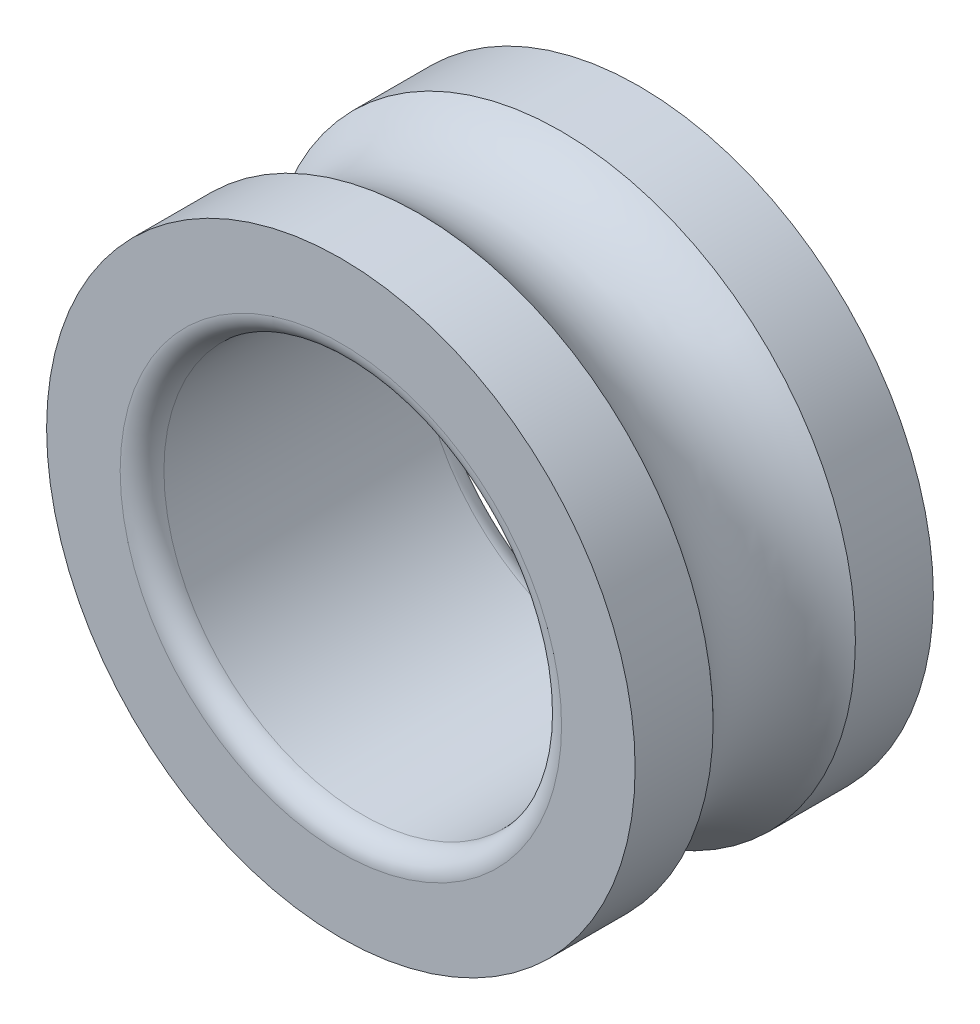
ISO-10303-21;
HEADER;
FILE_DESCRIPTION(('STEP AP214'),'2;1');
FILE_NAME('part.step','',(''),(''),'','','');
FILE_SCHEMA(('AUTOMOTIVE_DESIGN { 1 0 10303 214 1 1 1 1 }'));
ENDSEC;
DATA;
#1=APPLICATION_CONTEXT('core data for automotive mechanical design processes');
#2=APPLICATION_PROTOCOL_DEFINITION('international standard','automotive_design',2000,#1);
#3=PRODUCT_CONTEXT('',#1,'mechanical');
#4=PRODUCT('Part','Part','',(#3));
#5=PRODUCT_RELATED_PRODUCT_CATEGORY('part','',(#4));
#6=PRODUCT_DEFINITION_FORMATION('','',#4);
#7=PRODUCT_DEFINITION_CONTEXT('part definition',#1,'design');
#8=PRODUCT_DEFINITION('design','',#6,#7);
#9=PRODUCT_DEFINITION_SHAPE('','',#8);
#10=(LENGTH_UNIT() NAMED_UNIT(*) SI_UNIT(.MILLI.,.METRE.));
#11=(NAMED_UNIT(*) PLANE_ANGLE_UNIT() SI_UNIT($,.RADIAN.));
#12=(NAMED_UNIT(*) SI_UNIT($,.STERADIAN.) SOLID_ANGLE_UNIT());
#13=UNCERTAINTY_MEASURE_WITH_UNIT(LENGTH_MEASURE(1.E-05),#10,'distance_accuracy_value','');
#14=(GEOMETRIC_REPRESENTATION_CONTEXT(3) GLOBAL_UNCERTAINTY_ASSIGNED_CONTEXT((#13)) GLOBAL_UNIT_ASSIGNED_CONTEXT((#10,
#11,#12)) REPRESENTATION_CONTEXT('',''));
#15=CARTESIAN_POINT('',(0.,0.,0.));
#16=DIRECTION('',(0.,0.,1.));
#17=DIRECTION('',(1.,0.,0.));
#18=AXIS2_PLACEMENT_3D('',#15,#16,#17);
#19=CARTESIAN_POINT('',(0.,0.,0.));
#20=DIRECTION('',(0.,0.,-1.));
#21=DIRECTION('',(-1.,0.,0.));
#22=AXIS2_PLACEMENT_3D('',#19,#20,#21);
#23=TOROIDAL_SURFACE('',#22,12.42,3.312);
#24=CARTESIAN_POINT('',(0.,0.,-2.46861904715977));
#25=DIRECTION('',(0.,0.,-1.));
#26=DIRECTION('',(-1.,0.,0.));
#27=AXIS2_PLACEMENT_3D('',#24,#25,#26);
#28=CIRCLE('',#27,10.212);
#29=CARTESIAN_POINT('',(-10.212,0.,-2.46861904715977));
#30=VERTEX_POINT('',#29);
#31=EDGE_CURVE('E69',#30,#30,#28,.T.);
#32=ORIENTED_EDGE('',*,*,#31,.F.);
#33=EDGE_LOOP('',(#32));
#34=FACE_BOUND('',#33,.T.);
#35=CARTESIAN_POINT('',(0.,0.,2.46861904715977));
#36=DIRECTION('',(0.,0.,-1.));
#37=DIRECTION('',(-1.,0.,0.));
#38=AXIS2_PLACEMENT_3D('',#35,#36,#37);
#39=CIRCLE('',#38,10.212);
#40=CARTESIAN_POINT('',(-10.212,0.,2.46861904715977));
#41=VERTEX_POINT('',#40);
#42=EDGE_CURVE('E60',#41,#41,#39,.T.);
#43=ORIENTED_EDGE('',*,*,#42,.T.);
#44=EDGE_LOOP('',(#43));
#45=FACE_BOUND('',#44,.T.);
#46=ADVANCED_FACE('F40',(#34,#45),#23,.F.);
#47=CARTESIAN_POINT('',(0.,0.,0.));
#48=DIRECTION('',(0.,0.,-1.));
#49=DIRECTION('',(-1.,0.,0.));
#50=AXIS2_PLACEMENT_3D('',#47,#48,#49);
#51=CYLINDRICAL_SURFACE('',#50,10.212);
#52=ORIENTED_EDGE('',*,*,#42,.F.);
#53=EDGE_LOOP('',(#52));
#54=FACE_BOUND('',#53,.T.);
#55=CARTESIAN_POINT('',(0.,0.,5.175));
#56=DIRECTION('',(0.,0.,-1.));
#57=DIRECTION('',(-1.,0.,0.));
#58=AXIS2_PLACEMENT_3D('',#55,#56,#57);
#59=CIRCLE('',#58,10.212);
#60=CARTESIAN_POINT('',(-10.212,0.,5.175));
#61=VERTEX_POINT('',#60);
#62=EDGE_CURVE('E63',#61,#61,#59,.T.);
#63=ORIENTED_EDGE('',*,*,#62,.T.);
#64=EDGE_LOOP('',(#63));
#65=FACE_BOUND('',#64,.T.);
#66=ADVANCED_FACE('F77',(#54,#65),#51,.T.);
#67=CARTESIAN_POINT('',(0.,0.,5.175));
#68=DIRECTION('',(0.,0.,-1.));
#69=DIRECTION('',(-1.,0.,0.));
#70=AXIS2_PLACEMENT_3D('',#67,#68,#69);
#71=PLANE('',#70);
#72=CARTESIAN_POINT('',(0.,0.,5.175));
#73=DIRECTION('',(0.,0.,-1.));
#74=DIRECTION('',(-1.,0.,0.));
#75=AXIS2_PLACEMENT_3D('',#72,#73,#74);
#76=CIRCLE('',#75,7.659);
#77=CARTESIAN_POINT('',(-7.659,0.,5.175));
#78=VERTEX_POINT('',#77);
#79=EDGE_CURVE('E55',#78,#78,#76,.T.);
#80=ORIENTED_EDGE('',*,*,#79,.T.);
#81=EDGE_LOOP('',(#80));
#82=FACE_BOUND('',#81,.T.);
#83=ORIENTED_EDGE('',*,*,#62,.F.);
#84=EDGE_LOOP('',(#83));
#85=FACE_BOUND('',#84,.T.);
#86=ADVANCED_FACE('F83',(#82,#85),#71,.F.);
#87=CARTESIAN_POINT('',(0.,0.,0.));
#88=DIRECTION('',(0.,0.,-1.));
#89=DIRECTION('',(-1.,0.,0.));
#90=AXIS2_PLACEMENT_3D('',#87,#88,#89);
#91=CYLINDRICAL_SURFACE('',#90,6.9);
#92=CARTESIAN_POINT('',(0.,0.,4.416));
#93=DIRECTION('',(0.,0.,-1.));
#94=DIRECTION('',(-1.,0.,0.));
#95=AXIS2_PLACEMENT_3D('',#92,#93,#94);
#96=CIRCLE('',#95,6.9);
#97=CARTESIAN_POINT('',(-6.9,0.,4.416));
#98=VERTEX_POINT('',#97);
#99=EDGE_CURVE('E47',#98,#98,#96,.F.);
#100=ORIENTED_EDGE('',*,*,#99,.T.);
#101=EDGE_LOOP('',(#100));
#102=FACE_BOUND('',#101,.T.);
#103=CARTESIAN_POINT('',(0.,0.,-4.416));
#104=DIRECTION('',(0.,0.,-1.));
#105=DIRECTION('',(-1.,0.,0.));
#106=AXIS2_PLACEMENT_3D('',#103,#104,#105);
#107=CIRCLE('',#106,6.9);
#108=CARTESIAN_POINT('',(-6.9,0.,-4.416));
#109=VERTEX_POINT('',#108);
#110=EDGE_CURVE('E51',#109,#109,#107,.T.);
#111=ORIENTED_EDGE('',*,*,#110,.T.);
#112=EDGE_LOOP('',(#111));
#113=FACE_BOUND('',#112,.T.);
#114=ADVANCED_FACE('F88',(#102,#113),#91,.F.);
#115=CARTESIAN_POINT('',(0.,0.,-5.175));
#116=DIRECTION('',(0.,0.,-1.));
#117=DIRECTION('',(-1.,0.,0.));
#118=AXIS2_PLACEMENT_3D('',#115,#116,#117);
#119=PLANE('',#118);
#120=CARTESIAN_POINT('',(0.,0.,-5.175));
#121=DIRECTION('',(0.,0.,-1.));
#122=DIRECTION('',(-1.,0.,0.));
#123=AXIS2_PLACEMENT_3D('',#120,#121,#122);
#124=CIRCLE('',#123,7.659);
#125=CARTESIAN_POINT('',(-7.659,0.,-5.175));
#126=VERTEX_POINT('',#125);
#127=EDGE_CURVE('E10',#126,#126,#124,.F.);
#128=ORIENTED_EDGE('',*,*,#127,.T.);
#129=EDGE_LOOP('',(#128));
#130=FACE_BOUND('',#129,.T.);
#131=CARTESIAN_POINT('',(0.,0.,-5.175));
#132=DIRECTION('',(0.,0.,-1.));
#133=DIRECTION('',(-1.,0.,0.));
#134=AXIS2_PLACEMENT_3D('',#131,#132,#133);
#135=CIRCLE('',#134,10.212);
#136=CARTESIAN_POINT('',(-10.212,0.,-5.175));
#137=VERTEX_POINT('',#136);
#138=EDGE_CURVE('E66',#137,#137,#135,.T.);
#139=ORIENTED_EDGE('',*,*,#138,.T.);
#140=EDGE_LOOP('',(#139));
#141=FACE_BOUND('',#140,.T.);
#142=ADVANCED_FACE('F94',(#130,#141),#119,.T.);
#143=ORIENTED_EDGE('',*,*,#138,.F.);
#144=EDGE_LOOP('',(#143));
#145=FACE_BOUND('',#144,.T.);
#146=ORIENTED_EDGE('',*,*,#31,.T.);
#147=EDGE_LOOP('',(#146));
#148=FACE_BOUND('',#147,.T.);
#149=ADVANCED_FACE('F73',(#145,#148),#51,.T.);
#150=CARTESIAN_POINT('',(0.,0.,4.416));
#151=DIRECTION('',(0.,0.,-1.));
#152=DIRECTION('',(-1.,0.,0.));
#153=AXIS2_PLACEMENT_3D('',#150,#151,#152);
#154=TOROIDAL_SURFACE('',#153,7.659,0.759);
#155=ORIENTED_EDGE('',*,*,#99,.F.);
#156=EDGE_LOOP('',(#155));
#157=FACE_BOUND('',#156,.T.);
#158=ORIENTED_EDGE('',*,*,#79,.F.);
#159=EDGE_LOOP('',(#158));
#160=FACE_BOUND('',#159,.T.);
#161=ADVANCED_FACE('F97',(#157,#160),#154,.T.);
#162=CARTESIAN_POINT('',(0.,0.,-4.416));
#163=DIRECTION('',(0.,0.,-1.));
#164=DIRECTION('',(-1.,0.,0.));
#165=AXIS2_PLACEMENT_3D('',#162,#163,#164);
#166=TOROIDAL_SURFACE('',#165,7.659,0.759);
#167=ORIENTED_EDGE('',*,*,#127,.F.);
#168=EDGE_LOOP('',(#167));
#169=FACE_BOUND('',#168,.T.);
#170=ORIENTED_EDGE('',*,*,#110,.F.);
#171=EDGE_LOOP('',(#170));
#172=FACE_BOUND('',#171,.T.);
#173=ADVANCED_FACE('F42',(#169,#172),#166,.T.);
#174=CLOSED_SHELL('',(#46,#66,#86,#114,#142,#149,#161,#173));
#175=MANIFOLD_SOLID_BREP('B2',#174);
#176=ADVANCED_BREP_SHAPE_REPRESENTATION('',(#18,#175),#14);
#177=SHAPE_DEFINITION_REPRESENTATION(#9,#176);
ENDSEC;
END-ISO-10303-21;
